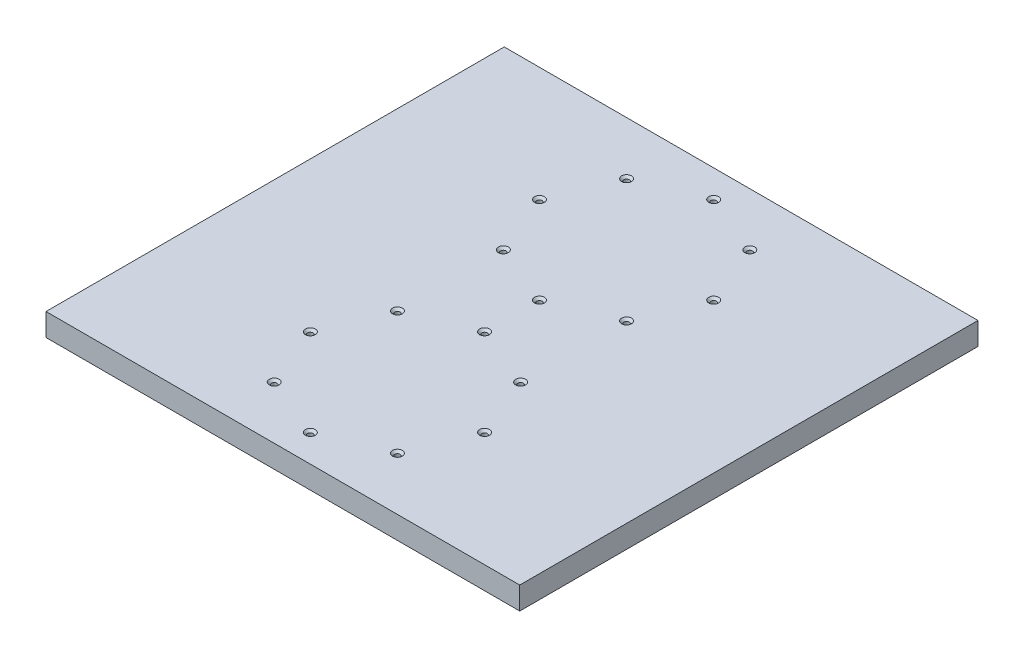
ISO-10303-21;
HEADER;
FILE_DESCRIPTION(('STEP AP214'),'2;1');
FILE_NAME('part.step','',(''),(''),'','','');
FILE_SCHEMA(('AUTOMOTIVE_DESIGN { 1 0 10303 214 1 1 1 1 }'));
ENDSEC;
DATA;
#1=APPLICATION_CONTEXT('core data for automotive mechanical design processes');
#2=APPLICATION_PROTOCOL_DEFINITION('international standard','automotive_design',2000,#1);
#3=PRODUCT_CONTEXT('',#1,'mechanical');
#4=PRODUCT('Part','Part','',(#3));
#5=PRODUCT_RELATED_PRODUCT_CATEGORY('part','',(#4));
#6=PRODUCT_DEFINITION_FORMATION('','',#4);
#7=PRODUCT_DEFINITION_CONTEXT('part definition',#1,'design');
#8=PRODUCT_DEFINITION('design','',#6,#7);
#9=PRODUCT_DEFINITION_SHAPE('','',#8);
#10=(LENGTH_UNIT() NAMED_UNIT(*) SI_UNIT(.MILLI.,.METRE.));
#11=(NAMED_UNIT(*) PLANE_ANGLE_UNIT() SI_UNIT($,.RADIAN.));
#12=(NAMED_UNIT(*) SI_UNIT($,.STERADIAN.) SOLID_ANGLE_UNIT());
#13=UNCERTAINTY_MEASURE_WITH_UNIT(LENGTH_MEASURE(1.E-05),#10,'distance_accuracy_value','');
#14=(GEOMETRIC_REPRESENTATION_CONTEXT(3) GLOBAL_UNCERTAINTY_ASSIGNED_CONTEXT((#13)) GLOBAL_UNIT_ASSIGNED_CONTEXT((#10,
#11,#12)) REPRESENTATION_CONTEXT('',''));
#15=CARTESIAN_POINT('',(0.,0.,0.));
#16=DIRECTION('',(0.,0.,1.));
#17=DIRECTION('',(1.,0.,0.));
#18=AXIS2_PLACEMENT_3D('',#15,#16,#17);
#19=CARTESIAN_POINT('',(-104.993043249937,10.,-50.7808728938607));
#20=DIRECTION('',(1.,0.,0.));
#21=DIRECTION('',(0.,0.,-1.));
#22=AXIS2_PLACEMENT_3D('',#19,#20,#21);
#23=PLANE('',#22);
#24=DIRECTION('',(0.,0.,1.));
#25=VECTOR('',#24,1.);
#26=CARTESIAN_POINT('',(-104.993043249937,0.,-50.7808728938607));
#27=LINE('',#26,#25);
#28=CARTESIAN_POINT('',(-104.993043249937,0.,-152.342618681582));
#29=VERTEX_POINT('',#28);
#30=CARTESIAN_POINT('',(-104.993043249937,0.,50.7808728938607));
#31=VERTEX_POINT('',#30);
#32=EDGE_CURVE('E76',#29,#31,#27,.T.);
#33=ORIENTED_EDGE('',*,*,#32,.T.);
#34=DIRECTION('',(0.,-1.,0.));
#35=VECTOR('',#34,1.);
#36=CARTESIAN_POINT('',(-104.993043249937,10.,50.7808728938607));
#37=LINE('',#36,#35);
#38=CARTESIAN_POINT('',(-104.993043249937,10.,50.7808728938607));
#39=VERTEX_POINT('',#38);
#40=EDGE_CURVE('E11',#39,#31,#37,.T.);
#41=ORIENTED_EDGE('',*,*,#40,.F.);
#42=DIRECTION('',(0.,0.,1.));
#43=VECTOR('',#42,1.);
#44=CARTESIAN_POINT('',(-104.993043249937,10.,-50.7808728938607));
#45=LINE('',#44,#43);
#46=CARTESIAN_POINT('',(-104.993043249937,10.,-152.342618681582));
#47=VERTEX_POINT('',#46);
#48=EDGE_CURVE('E67',#47,#39,#45,.T.);
#49=ORIENTED_EDGE('',*,*,#48,.F.);
#50=DIRECTION('',(0.,-1.,0.));
#51=VECTOR('',#50,1.);
#52=CARTESIAN_POINT('',(-104.993043249937,10.,-152.342618681582));
#53=LINE('',#52,#51);
#54=EDGE_CURVE('E82',#47,#29,#53,.T.);
#55=ORIENTED_EDGE('',*,*,#54,.T.);
#56=EDGE_LOOP('',(#33,#41,#49,#55));
#57=FACE_BOUND('',#56,.T.);
#58=ADVANCED_FACE('F33',(#57),#23,.F.);
#59=CARTESIAN_POINT('',(-104.993043249937,10.,50.7808728938607));
#60=DIRECTION('',(0.,0.,-1.));
#61=DIRECTION('',(-1.,0.,0.));
#62=AXIS2_PLACEMENT_3D('',#59,#60,#61);
#63=PLANE('',#62);
#64=DIRECTION('',(1.,0.,0.));
#65=VECTOR('',#64,1.);
#66=CARTESIAN_POINT('',(-104.993043249937,0.,50.7808728938607));
#67=LINE('',#66,#65);
#68=CARTESIAN_POINT('',(104.993043249937,0.,50.7808728938607));
#69=VERTEX_POINT('',#68);
#70=EDGE_CURVE('E60',#31,#69,#67,.T.);
#71=ORIENTED_EDGE('',*,*,#70,.T.);
#72=DIRECTION('',(0.,-1.,0.));
#73=VECTOR('',#72,1.);
#74=CARTESIAN_POINT('',(104.993043249937,10.,50.7808728938607));
#75=LINE('',#74,#73);
#76=CARTESIAN_POINT('',(104.993043249937,10.,50.7808728938607));
#77=VERTEX_POINT('',#76);
#78=EDGE_CURVE('E41',#77,#69,#75,.T.);
#79=ORIENTED_EDGE('',*,*,#78,.F.);
#80=DIRECTION('',(1.,0.,0.));
#81=VECTOR('',#80,1.);
#82=CARTESIAN_POINT('',(-104.993043249937,10.,50.7808728938607));
#83=LINE('',#82,#81);
#84=EDGE_CURVE('E49',#39,#77,#83,.T.);
#85=ORIENTED_EDGE('',*,*,#84,.F.);
#86=ORIENTED_EDGE('',*,*,#40,.T.);
#87=EDGE_LOOP('',(#71,#79,#85,#86));
#88=FACE_BOUND('',#87,.T.);
#89=ADVANCED_FACE('F182',(#88),#63,.F.);
#90=CARTESIAN_POINT('',(104.993043249937,10.,-50.7808728938607));
#91=DIRECTION('',(-1.,0.,0.));
#92=DIRECTION('',(0.,0.,1.));
#93=AXIS2_PLACEMENT_3D('',#90,#91,#92);
#94=PLANE('',#93);
#95=DIRECTION('',(0.,0.,-1.));
#96=VECTOR('',#95,1.);
#97=CARTESIAN_POINT('',(104.993043249937,0.,-50.7808728938607));
#98=LINE('',#97,#96);
#99=CARTESIAN_POINT('',(104.993043249937,0.,-152.342618681582));
#100=VERTEX_POINT('',#99);
#101=EDGE_CURVE('E172',#69,#100,#98,.T.);
#102=ORIENTED_EDGE('',*,*,#101,.T.);
#103=DIRECTION('',(0.,-1.,0.));
#104=VECTOR('',#103,1.);
#105=CARTESIAN_POINT('',(104.993043249937,10.,-152.342618681582));
#106=LINE('',#105,#104);
#107=CARTESIAN_POINT('',(104.993043249937,10.,-152.342618681582));
#108=VERTEX_POINT('',#107);
#109=EDGE_CURVE('E86',#108,#100,#106,.T.);
#110=ORIENTED_EDGE('',*,*,#109,.F.);
#111=DIRECTION('',(0.,0.,-1.));
#112=VECTOR('',#111,1.);
#113=CARTESIAN_POINT('',(104.993043249937,10.,-50.7808728938607));
#114=LINE('',#113,#112);
#115=EDGE_CURVE('E174',#77,#108,#114,.T.);
#116=ORIENTED_EDGE('',*,*,#115,.F.);
#117=ORIENTED_EDGE('',*,*,#78,.T.);
#118=EDGE_LOOP('',(#102,#110,#116,#117));
#119=FACE_BOUND('',#118,.T.);
#120=ADVANCED_FACE('F180',(#119),#94,.F.);
#121=CARTESIAN_POINT('',(0.,10.,0.));
#122=DIRECTION('',(0.,1.,0.));
#123=DIRECTION('',(0.,0.,1.));
#124=AXIS2_PLACEMENT_3D('',#121,#122,#123);
#125=PLANE('',#124);
#126=CARTESIAN_POINT('',(-27.3055006811137,10.,-128.867246468835));
#127=DIRECTION('',(0.,1.,0.));
#128=DIRECTION('',(0.,0.,1.));
#129=AXIS2_PLACEMENT_3D('',#126,#127,#128);
#130=CIRCLE('',#129,2.2);
#131=CARTESIAN_POINT('',(-27.3055006811137,10.,-126.667246468835));
#132=VERTEX_POINT('',#131);
#133=EDGE_CURVE('E627',#132,#132,#130,.T.);
#134=ORIENTED_EDGE('',*,*,#133,.F.);
#135=EDGE_LOOP('',(#134));
#136=FACE_BOUND('',#135,.T.);
#137=CARTESIAN_POINT('',(-4.04479133615002E-13,10.,-140.17755517834));
#138=DIRECTION('',(0.,1.,0.));
#139=DIRECTION('',(0.,0.,1.));
#140=AXIS2_PLACEMENT_3D('',#137,#138,#139);
#141=CIRCLE('',#140,2.2);
#142=CARTESIAN_POINT('',(-4.04479133615002E-13,10.,-137.97755517834));
#143=VERTEX_POINT('',#142);
#144=EDGE_CURVE('E634',#143,#143,#141,.T.);
#145=ORIENTED_EDGE('',*,*,#144,.F.);
#146=EDGE_LOOP('',(#145));
#147=FACE_BOUND('',#146,.T.);
#148=CARTESIAN_POINT('',(27.3055006811132,10.,-128.867246468835));
#149=DIRECTION('',(0.,1.,0.));
#150=DIRECTION('',(0.,0.,1.));
#151=AXIS2_PLACEMENT_3D('',#148,#149,#150);
#152=CIRCLE('',#151,2.2);
#153=CARTESIAN_POINT('',(27.3055006811132,10.,-126.667246468835));
#154=VERTEX_POINT('',#153);
#155=EDGE_CURVE('E643',#154,#154,#152,.T.);
#156=ORIENTED_EDGE('',*,*,#155,.F.);
#157=EDGE_LOOP('',(#156));
#158=FACE_BOUND('',#157,.T.);
#159=CARTESIAN_POINT('',(38.6158093906183,10.,-101.561745787721));
#160=DIRECTION('',(0.,1.,0.));
#161=DIRECTION('',(0.,0.,1.));
#162=AXIS2_PLACEMENT_3D('',#159,#160,#161);
#163=CIRCLE('',#162,2.2);
#164=CARTESIAN_POINT('',(38.6158093906183,10.,-99.3617457877215));
#165=VERTEX_POINT('',#164);
#166=EDGE_CURVE('E652',#165,#165,#163,.T.);
#167=ORIENTED_EDGE('',*,*,#166,.F.);
#168=EDGE_LOOP('',(#167));
#169=FACE_BOUND('',#168,.T.);
#170=CARTESIAN_POINT('',(27.3055006811135,10.,-74.2562451066082));
#171=DIRECTION('',(0.,1.,0.));
#172=DIRECTION('',(0.,0.,1.));
#173=AXIS2_PLACEMENT_3D('',#170,#171,#172);
#174=CIRCLE('',#173,2.2);
#175=CARTESIAN_POINT('',(27.3055006811135,10.,-72.0562451066082));
#176=VERTEX_POINT('',#175);
#177=EDGE_CURVE('E661',#176,#176,#174,.T.);
#178=ORIENTED_EDGE('',*,*,#177,.F.);
#179=EDGE_LOOP('',(#178));
#180=FACE_BOUND('',#179,.T.);
#181=CARTESIAN_POINT('',(1.34826377871667E-13,10.,-62.9459363971031));
#182=DIRECTION('',(0.,1.,0.));
#183=DIRECTION('',(0.,0.,1.));
#184=AXIS2_PLACEMENT_3D('',#181,#182,#183);
#185=CIRCLE('',#184,2.2);
#186=CARTESIAN_POINT('',(1.34826377871667E-13,10.,-60.7459363971031));
#187=VERTEX_POINT('',#186);
#188=EDGE_CURVE('E670',#187,#187,#185,.T.);
#189=ORIENTED_EDGE('',*,*,#188,.F.);
#190=EDGE_LOOP('',(#189));
#191=FACE_BOUND('',#190,.T.);
#192=CARTESIAN_POINT('',(-27.3055006811133,10.,-74.256245106608));
#193=DIRECTION('',(0.,1.,0.));
#194=DIRECTION('',(0.,0.,1.));
#195=AXIS2_PLACEMENT_3D('',#192,#193,#194);
#196=CIRCLE('',#195,2.2);
#197=CARTESIAN_POINT('',(-27.3055006811133,10.,-72.056245106608));
#198=VERTEX_POINT('',#197);
#199=EDGE_CURVE('E679',#198,#198,#196,.T.);
#200=ORIENTED_EDGE('',*,*,#199,.F.);
#201=EDGE_LOOP('',(#200));
#202=FACE_BOUND('',#201,.T.);
#203=CARTESIAN_POINT('',(-38.6158093906183,10.,-101.561745787721));
#204=DIRECTION('',(0.,1.,0.));
#205=DIRECTION('',(0.,0.,1.));
#206=AXIS2_PLACEMENT_3D('',#203,#204,#205);
#207=CIRCLE('',#206,2.2);
#208=CARTESIAN_POINT('',(-38.6158093906183,10.,-99.3617457877215));
#209=VERTEX_POINT('',#208);
#210=EDGE_CURVE('E688',#209,#209,#207,.T.);
#211=ORIENTED_EDGE('',*,*,#210,.F.);
#212=EDGE_LOOP('',(#211));
#213=FACE_BOUND('',#212,.T.);
#214=CARTESIAN_POINT('',(-27.3055006811137,10.,27.3055006811131));
#215=DIRECTION('',(0.,1.,0.));
#216=DIRECTION('',(0.,0.,1.));
#217=AXIS2_PLACEMENT_3D('',#214,#215,#216);
#218=CIRCLE('',#217,2.2);
#219=CARTESIAN_POINT('',(-27.3055006811137,10.,29.5055006811131));
#220=VERTEX_POINT('',#219);
#221=EDGE_CURVE('E100',#220,#220,#218,.T.);
#222=ORIENTED_EDGE('',*,*,#221,.F.);
#223=EDGE_LOOP('',(#222));
#224=FACE_BOUND('',#223,.T.);
#225=CARTESIAN_POINT('',(-4.04479133615002E-13,10.,38.6158093906183));
#226=DIRECTION('',(0.,1.,0.));
#227=DIRECTION('',(0.,0.,1.));
#228=AXIS2_PLACEMENT_3D('',#225,#226,#227);
#229=CIRCLE('',#228,2.2);
#230=CARTESIAN_POINT('',(-4.04479133615002E-13,10.,40.8158093906183));
#231=VERTEX_POINT('',#230);
#232=EDGE_CURVE('E109',#231,#231,#229,.T.);
#233=ORIENTED_EDGE('',*,*,#232,.F.);
#234=EDGE_LOOP('',(#233));
#235=FACE_BOUND('',#234,.T.);
#236=CARTESIAN_POINT('',(27.3055006811132,10.,27.3055006811136));
#237=DIRECTION('',(0.,1.,0.));
#238=DIRECTION('',(0.,0.,1.));
#239=AXIS2_PLACEMENT_3D('',#236,#237,#238);
#240=CIRCLE('',#239,2.2);
#241=CARTESIAN_POINT('',(27.3055006811132,10.,29.5055006811136));
#242=VERTEX_POINT('',#241);
#243=EDGE_CURVE('E118',#242,#242,#240,.T.);
#244=ORIENTED_EDGE('',*,*,#243,.F.);
#245=EDGE_LOOP('',(#244));
#246=FACE_BOUND('',#245,.T.);
#247=CARTESIAN_POINT('',(38.6158093906183,10.,0.));
#248=DIRECTION('',(0.,1.,0.));
#249=DIRECTION('',(0.,0.,1.));
#250=AXIS2_PLACEMENT_3D('',#247,#248,#249);
#251=CIRCLE('',#250,2.2);
#252=CARTESIAN_POINT('',(38.6158093906183,10.,2.2));
#253=VERTEX_POINT('',#252);
#254=EDGE_CURVE('E127',#253,#253,#251,.T.);
#255=ORIENTED_EDGE('',*,*,#254,.F.);
#256=EDGE_LOOP('',(#255));
#257=FACE_BOUND('',#256,.T.);
#258=CARTESIAN_POINT('',(27.3055006811135,10.,-27.3055006811132));
#259=DIRECTION('',(0.,1.,0.));
#260=DIRECTION('',(0.,0.,1.));
#261=AXIS2_PLACEMENT_3D('',#258,#259,#260);
#262=CIRCLE('',#261,2.2);
#263=CARTESIAN_POINT('',(27.3055006811135,10.,-25.1055006811132));
#264=VERTEX_POINT('',#263);
#265=EDGE_CURVE('E136',#264,#264,#262,.T.);
#266=ORIENTED_EDGE('',*,*,#265,.F.);
#267=EDGE_LOOP('',(#266));
#268=FACE_BOUND('',#267,.T.);
#269=CARTESIAN_POINT('',(1.34826377871667E-13,10.,-38.6158093906183));
#270=DIRECTION('',(0.,1.,0.));
#271=DIRECTION('',(0.,0.,1.));
#272=AXIS2_PLACEMENT_3D('',#269,#270,#271);
#273=CIRCLE('',#272,2.2);
#274=CARTESIAN_POINT('',(1.34826377871667E-13,10.,-36.4158093906183));
#275=VERTEX_POINT('',#274);
#276=EDGE_CURVE('E145',#275,#275,#273,.T.);
#277=ORIENTED_EDGE('',*,*,#276,.F.);
#278=EDGE_LOOP('',(#277));
#279=FACE_BOUND('',#278,.T.);
#280=CARTESIAN_POINT('',(-27.3055006811133,10.,-27.3055006811134));
#281=DIRECTION('',(0.,1.,0.));
#282=DIRECTION('',(0.,0.,1.));
#283=AXIS2_PLACEMENT_3D('',#280,#281,#282);
#284=CIRCLE('',#283,2.2);
#285=CARTESIAN_POINT('',(-27.3055006811133,10.,-25.1055006811134));
#286=VERTEX_POINT('',#285);
#287=EDGE_CURVE('E154',#286,#286,#284,.T.);
#288=ORIENTED_EDGE('',*,*,#287,.F.);
#289=EDGE_LOOP('',(#288));
#290=FACE_BOUND('',#289,.T.);
#291=CARTESIAN_POINT('',(-38.6158093906183,10.,0.));
#292=DIRECTION('',(0.,1.,0.));
#293=DIRECTION('',(0.,0.,1.));
#294=AXIS2_PLACEMENT_3D('',#291,#292,#293);
#295=CIRCLE('',#294,2.2);
#296=CARTESIAN_POINT('',(-38.6158093906183,10.,2.2));
#297=VERTEX_POINT('',#296);
#298=EDGE_CURVE('E163',#297,#297,#295,.T.);
#299=ORIENTED_EDGE('',*,*,#298,.F.);
#300=EDGE_LOOP('',(#299));
#301=FACE_BOUND('',#300,.T.);
#302=ORIENTED_EDGE('',*,*,#48,.T.);
#303=ORIENTED_EDGE('',*,*,#84,.T.);
#304=ORIENTED_EDGE('',*,*,#115,.T.);
#305=DIRECTION('',(1.,0.,0.));
#306=VECTOR('',#305,1.);
#307=CARTESIAN_POINT('',(-104.993043249937,10.,-152.342618681582));
#308=LINE('',#307,#306);
#309=EDGE_CURVE('E87',#47,#108,#308,.T.);
#310=ORIENTED_EDGE('',*,*,#309,.F.);
#311=EDGE_LOOP('',(#302,#303,#304,#310));
#312=FACE_BOUND('',#311,.T.);
#313=ADVANCED_FACE('F183',(#136,#147,#158,#169,#180,#191,#202,#213,#224,#235,#246,#257,#268,
#279,#290,#301,#312),#125,.T.);
#314=CARTESIAN_POINT('',(0.,0.,0.));
#315=DIRECTION('',(0.,1.,0.));
#316=DIRECTION('',(0.,0.,1.));
#317=AXIS2_PLACEMENT_3D('',#314,#315,#316);
#318=PLANE('',#317);
#319=CARTESIAN_POINT('',(-27.3055006811137,0.,-128.867246468835));
#320=DIRECTION('',(0.,1.,0.));
#321=DIRECTION('',(0.,0.,1.));
#322=AXIS2_PLACEMENT_3D('',#319,#320,#321);
#323=CIRCLE('',#322,1.2);
#324=CARTESIAN_POINT('',(-27.3055006811137,0.,-127.667246468835));
#325=VERTEX_POINT('',#324);
#326=EDGE_CURVE('E629',#325,#325,#323,.T.);
#327=ORIENTED_EDGE('',*,*,#326,.T.);
#328=EDGE_LOOP('',(#327));
#329=FACE_BOUND('',#328,.T.);
#330=CARTESIAN_POINT('',(-4.04479133615002E-13,0.,-140.17755517834));
#331=DIRECTION('',(0.,1.,0.));
#332=DIRECTION('',(0.,0.,1.));
#333=AXIS2_PLACEMENT_3D('',#330,#331,#332);
#334=CIRCLE('',#333,1.2);
#335=CARTESIAN_POINT('',(-4.04479133615002E-13,0.,-138.97755517834));
#336=VERTEX_POINT('',#335);
#337=EDGE_CURVE('E640',#336,#336,#334,.T.);
#338=ORIENTED_EDGE('',*,*,#337,.T.);
#339=EDGE_LOOP('',(#338));
#340=FACE_BOUND('',#339,.T.);
#341=CARTESIAN_POINT('',(27.3055006811132,0.,-128.867246468835));
#342=DIRECTION('',(0.,1.,0.));
#343=DIRECTION('',(0.,0.,1.));
#344=AXIS2_PLACEMENT_3D('',#341,#342,#343);
#345=CIRCLE('',#344,1.2);
#346=CARTESIAN_POINT('',(27.3055006811132,0.,-127.667246468835));
#347=VERTEX_POINT('',#346);
#348=EDGE_CURVE('E649',#347,#347,#345,.T.);
#349=ORIENTED_EDGE('',*,*,#348,.T.);
#350=EDGE_LOOP('',(#349));
#351=FACE_BOUND('',#350,.T.);
#352=CARTESIAN_POINT('',(38.6158093906183,0.,-101.561745787721));
#353=DIRECTION('',(0.,1.,0.));
#354=DIRECTION('',(0.,0.,1.));
#355=AXIS2_PLACEMENT_3D('',#352,#353,#354);
#356=CIRCLE('',#355,1.2);
#357=CARTESIAN_POINT('',(38.6158093906183,0.,-100.361745787721));
#358=VERTEX_POINT('',#357);
#359=EDGE_CURVE('E658',#358,#358,#356,.T.);
#360=ORIENTED_EDGE('',*,*,#359,.T.);
#361=EDGE_LOOP('',(#360));
#362=FACE_BOUND('',#361,.T.);
#363=CARTESIAN_POINT('',(27.3055006811135,0.,-74.2562451066082));
#364=DIRECTION('',(0.,1.,0.));
#365=DIRECTION('',(0.,0.,1.));
#366=AXIS2_PLACEMENT_3D('',#363,#364,#365);
#367=CIRCLE('',#366,1.2);
#368=CARTESIAN_POINT('',(27.3055006811135,0.,-73.0562451066082));
#369=VERTEX_POINT('',#368);
#370=EDGE_CURVE('E667',#369,#369,#367,.T.);
#371=ORIENTED_EDGE('',*,*,#370,.T.);
#372=EDGE_LOOP('',(#371));
#373=FACE_BOUND('',#372,.T.);
#374=CARTESIAN_POINT('',(1.34826377871667E-13,0.,-62.9459363971031));
#375=DIRECTION('',(0.,1.,0.));
#376=DIRECTION('',(0.,0.,1.));
#377=AXIS2_PLACEMENT_3D('',#374,#375,#376);
#378=CIRCLE('',#377,1.2);
#379=CARTESIAN_POINT('',(1.34826377871667E-13,0.,-61.7459363971031));
#380=VERTEX_POINT('',#379);
#381=EDGE_CURVE('E676',#380,#380,#378,.T.);
#382=ORIENTED_EDGE('',*,*,#381,.T.);
#383=EDGE_LOOP('',(#382));
#384=FACE_BOUND('',#383,.T.);
#385=CARTESIAN_POINT('',(-27.3055006811133,0.,-74.256245106608));
#386=DIRECTION('',(0.,1.,0.));
#387=DIRECTION('',(0.,0.,1.));
#388=AXIS2_PLACEMENT_3D('',#385,#386,#387);
#389=CIRCLE('',#388,1.2);
#390=CARTESIAN_POINT('',(-27.3055006811133,0.,-73.056245106608));
#391=VERTEX_POINT('',#390);
#392=EDGE_CURVE('E685',#391,#391,#389,.T.);
#393=ORIENTED_EDGE('',*,*,#392,.T.);
#394=EDGE_LOOP('',(#393));
#395=FACE_BOUND('',#394,.T.);
#396=CARTESIAN_POINT('',(-38.6158093906183,0.,-101.561745787721));
#397=DIRECTION('',(0.,1.,0.));
#398=DIRECTION('',(0.,0.,1.));
#399=AXIS2_PLACEMENT_3D('',#396,#397,#398);
#400=CIRCLE('',#399,1.2);
#401=CARTESIAN_POINT('',(-38.6158093906183,0.,-100.361745787721));
#402=VERTEX_POINT('',#401);
#403=EDGE_CURVE('E92',#402,#402,#400,.T.);
#404=ORIENTED_EDGE('',*,*,#403,.T.);
#405=EDGE_LOOP('',(#404));
#406=FACE_BOUND('',#405,.T.);
#407=CARTESIAN_POINT('',(-27.3055006811137,0.,27.3055006811131));
#408=DIRECTION('',(0.,1.,0.));
#409=DIRECTION('',(0.,0.,1.));
#410=AXIS2_PLACEMENT_3D('',#407,#408,#409);
#411=CIRCLE('',#410,1.2);
#412=CARTESIAN_POINT('',(-27.3055006811137,0.,28.5055006811131));
#413=VERTEX_POINT('',#412);
#414=EDGE_CURVE('E106',#413,#413,#411,.T.);
#415=ORIENTED_EDGE('',*,*,#414,.T.);
#416=EDGE_LOOP('',(#415));
#417=FACE_BOUND('',#416,.T.);
#418=CARTESIAN_POINT('',(-4.04479133615002E-13,0.,38.6158093906183));
#419=DIRECTION('',(0.,1.,0.));
#420=DIRECTION('',(0.,0.,1.));
#421=AXIS2_PLACEMENT_3D('',#418,#419,#420);
#422=CIRCLE('',#421,1.2);
#423=CARTESIAN_POINT('',(-4.04479133615002E-13,0.,39.8158093906183));
#424=VERTEX_POINT('',#423);
#425=EDGE_CURVE('E115',#424,#424,#422,.T.);
#426=ORIENTED_EDGE('',*,*,#425,.T.);
#427=EDGE_LOOP('',(#426));
#428=FACE_BOUND('',#427,.T.);
#429=CARTESIAN_POINT('',(27.3055006811132,0.,27.3055006811136));
#430=DIRECTION('',(0.,1.,0.));
#431=DIRECTION('',(0.,0.,1.));
#432=AXIS2_PLACEMENT_3D('',#429,#430,#431);
#433=CIRCLE('',#432,1.2);
#434=CARTESIAN_POINT('',(27.3055006811132,0.,28.5055006811136));
#435=VERTEX_POINT('',#434);
#436=EDGE_CURVE('E124',#435,#435,#433,.T.);
#437=ORIENTED_EDGE('',*,*,#436,.T.);
#438=EDGE_LOOP('',(#437));
#439=FACE_BOUND('',#438,.T.);
#440=CARTESIAN_POINT('',(38.6158093906183,0.,0.));
#441=DIRECTION('',(0.,1.,0.));
#442=DIRECTION('',(0.,0.,1.));
#443=AXIS2_PLACEMENT_3D('',#440,#441,#442);
#444=CIRCLE('',#443,1.2);
#445=CARTESIAN_POINT('',(38.6158093906183,0.,1.2));
#446=VERTEX_POINT('',#445);
#447=EDGE_CURVE('E133',#446,#446,#444,.T.);
#448=ORIENTED_EDGE('',*,*,#447,.T.);
#449=EDGE_LOOP('',(#448));
#450=FACE_BOUND('',#449,.T.);
#451=CARTESIAN_POINT('',(27.3055006811135,0.,-27.3055006811132));
#452=DIRECTION('',(0.,1.,0.));
#453=DIRECTION('',(0.,0.,1.));
#454=AXIS2_PLACEMENT_3D('',#451,#452,#453);
#455=CIRCLE('',#454,1.2);
#456=CARTESIAN_POINT('',(27.3055006811135,0.,-26.1055006811133));
#457=VERTEX_POINT('',#456);
#458=EDGE_CURVE('E142',#457,#457,#455,.T.);
#459=ORIENTED_EDGE('',*,*,#458,.T.);
#460=EDGE_LOOP('',(#459));
#461=FACE_BOUND('',#460,.T.);
#462=CARTESIAN_POINT('',(1.34826377871667E-13,0.,-38.6158093906183));
#463=DIRECTION('',(0.,1.,0.));
#464=DIRECTION('',(0.,0.,1.));
#465=AXIS2_PLACEMENT_3D('',#462,#463,#464);
#466=CIRCLE('',#465,1.2);
#467=CARTESIAN_POINT('',(1.34826377871667E-13,0.,-37.4158093906183));
#468=VERTEX_POINT('',#467);
#469=EDGE_CURVE('E151',#468,#468,#466,.T.);
#470=ORIENTED_EDGE('',*,*,#469,.T.);
#471=EDGE_LOOP('',(#470));
#472=FACE_BOUND('',#471,.T.);
#473=CARTESIAN_POINT('',(-27.3055006811133,0.,-27.3055006811134));
#474=DIRECTION('',(0.,1.,0.));
#475=DIRECTION('',(0.,0.,1.));
#476=AXIS2_PLACEMENT_3D('',#473,#474,#475);
#477=CIRCLE('',#476,1.2);
#478=CARTESIAN_POINT('',(-27.3055006811133,0.,-26.1055006811134));
#479=VERTEX_POINT('',#478);
#480=EDGE_CURVE('E160',#479,#479,#477,.T.);
#481=ORIENTED_EDGE('',*,*,#480,.T.);
#482=EDGE_LOOP('',(#481));
#483=FACE_BOUND('',#482,.T.);
#484=CARTESIAN_POINT('',(-38.6158093906183,0.,0.));
#485=DIRECTION('',(0.,1.,0.));
#486=DIRECTION('',(0.,0.,1.));
#487=AXIS2_PLACEMENT_3D('',#484,#485,#486);
#488=CIRCLE('',#487,1.2);
#489=CARTESIAN_POINT('',(-38.6158093906183,0.,1.2));
#490=VERTEX_POINT('',#489);
#491=EDGE_CURVE('E80',#490,#490,#488,.T.);
#492=ORIENTED_EDGE('',*,*,#491,.T.);
#493=EDGE_LOOP('',(#492));
#494=FACE_BOUND('',#493,.T.);
#495=ORIENTED_EDGE('',*,*,#32,.F.);
#496=DIRECTION('',(1.,0.,0.));
#497=VECTOR('',#496,1.);
#498=CARTESIAN_POINT('',(-104.993043249937,0.,-152.342618681582));
#499=LINE('',#498,#497);
#500=EDGE_CURVE('E79',#29,#100,#499,.T.);
#501=ORIENTED_EDGE('',*,*,#500,.T.);
#502=ORIENTED_EDGE('',*,*,#101,.F.);
#503=ORIENTED_EDGE('',*,*,#70,.F.);
#504=EDGE_LOOP('',(#495,#501,#502,#503));
#505=FACE_BOUND('',#504,.T.);
#506=ADVANCED_FACE('F77',(#329,#340,#351,#362,#373,#384,#395,#406,#417,#428,#439,#450,#461,#472,
#483,#494,#505),#318,.F.);
#507=CARTESIAN_POINT('',(-38.6158093906183,10.,0.));
#508=DIRECTION('',(0.,1.,0.));
#509=DIRECTION('',(0.,0.,1.));
#510=AXIS2_PLACEMENT_3D('',#507,#508,#509);
#511=CYLINDRICAL_SURFACE('',#510,1.2);
#512=ORIENTED_EDGE('',*,*,#491,.F.);
#513=EDGE_LOOP('',(#512));
#514=FACE_BOUND('',#513,.T.);
#515=CARTESIAN_POINT('',(-38.6158093906183,9.,0.));
#516=DIRECTION('',(0.,1.,0.));
#517=DIRECTION('',(0.,0.,1.));
#518=AXIS2_PLACEMENT_3D('',#515,#516,#517);
#519=CIRCLE('',#518,1.2);
#520=CARTESIAN_POINT('',(-38.6158093906183,9.,1.2));
#521=VERTEX_POINT('',#520);
#522=EDGE_CURVE('E166',#521,#521,#519,.T.);
#523=ORIENTED_EDGE('',*,*,#522,.T.);
#524=EDGE_LOOP('',(#523));
#525=FACE_BOUND('',#524,.T.);
#526=ADVANCED_FACE('F191',(#514,#525),#511,.F.);
#527=CARTESIAN_POINT('',(-38.6158093906183,10.,0.));
#528=DIRECTION('',(0.,1.,0.));
#529=DIRECTION('',(0.,0.,1.));
#530=AXIS2_PLACEMENT_3D('',#527,#528,#529);
#531=CONICAL_SURFACE('',#530,2.2,0.785398163397447);
#532=ORIENTED_EDGE('',*,*,#522,.F.);
#533=EDGE_LOOP('',(#532));
#534=FACE_BOUND('',#533,.T.);
#535=ORIENTED_EDGE('',*,*,#298,.T.);
#536=EDGE_LOOP('',(#535));
#537=FACE_BOUND('',#536,.T.);
#538=ADVANCED_FACE('F456',(#534,#537),#531,.F.);
#539=CARTESIAN_POINT('',(-27.3055006811133,10.,-27.3055006811134));
#540=DIRECTION('',(0.,1.,0.));
#541=DIRECTION('',(0.,0.,1.));
#542=AXIS2_PLACEMENT_3D('',#539,#540,#541);
#543=CYLINDRICAL_SURFACE('',#542,1.2);
#544=ORIENTED_EDGE('',*,*,#480,.F.);
#545=EDGE_LOOP('',(#544));
#546=FACE_BOUND('',#545,.T.);
#547=CARTESIAN_POINT('',(-27.3055006811133,9.,-27.3055006811134));
#548=DIRECTION('',(0.,1.,0.));
#549=DIRECTION('',(0.,0.,1.));
#550=AXIS2_PLACEMENT_3D('',#547,#548,#549);
#551=CIRCLE('',#550,1.2);
#552=CARTESIAN_POINT('',(-27.3055006811133,9.,-26.1055006811134));
#553=VERTEX_POINT('',#552);
#554=EDGE_CURVE('E157',#553,#553,#551,.T.);
#555=ORIENTED_EDGE('',*,*,#554,.T.);
#556=EDGE_LOOP('',(#555));
#557=FACE_BOUND('',#556,.T.);
#558=ADVANCED_FACE('F452',(#546,#557),#543,.F.);
#559=CARTESIAN_POINT('',(-27.3055006811133,10.,-27.3055006811134));
#560=DIRECTION('',(0.,1.,0.));
#561=DIRECTION('',(0.,0.,1.));
#562=AXIS2_PLACEMENT_3D('',#559,#560,#561);
#563=CONICAL_SURFACE('',#562,2.2,0.785398163397447);
#564=ORIENTED_EDGE('',*,*,#554,.F.);
#565=EDGE_LOOP('',(#564));
#566=FACE_BOUND('',#565,.T.);
#567=ORIENTED_EDGE('',*,*,#287,.T.);
#568=EDGE_LOOP('',(#567));
#569=FACE_BOUND('',#568,.T.);
#570=ADVANCED_FACE('F448',(#566,#569),#563,.F.);
#571=CARTESIAN_POINT('',(1.34826377871667E-13,10.,-38.6158093906183));
#572=DIRECTION('',(0.,1.,0.));
#573=DIRECTION('',(0.,0.,1.));
#574=AXIS2_PLACEMENT_3D('',#571,#572,#573);
#575=CYLINDRICAL_SURFACE('',#574,1.2);
#576=ORIENTED_EDGE('',*,*,#469,.F.);
#577=EDGE_LOOP('',(#576));
#578=FACE_BOUND('',#577,.T.);
#579=CARTESIAN_POINT('',(1.34826377871667E-13,9.,-38.6158093906183));
#580=DIRECTION('',(0.,1.,0.));
#581=DIRECTION('',(0.,0.,1.));
#582=AXIS2_PLACEMENT_3D('',#579,#580,#581);
#583=CIRCLE('',#582,1.2);
#584=CARTESIAN_POINT('',(1.34826377871667E-13,9.,-37.4158093906183));
#585=VERTEX_POINT('',#584);
#586=EDGE_CURVE('E148',#585,#585,#583,.T.);
#587=ORIENTED_EDGE('',*,*,#586,.T.);
#588=EDGE_LOOP('',(#587));
#589=FACE_BOUND('',#588,.T.);
#590=ADVANCED_FACE('F444',(#578,#589),#575,.F.);
#591=CARTESIAN_POINT('',(1.34826377871667E-13,10.,-38.6158093906183));
#592=DIRECTION('',(0.,1.,0.));
#593=DIRECTION('',(0.,0.,1.));
#594=AXIS2_PLACEMENT_3D('',#591,#592,#593);
#595=CONICAL_SURFACE('',#594,2.2,0.785398163397448);
#596=ORIENTED_EDGE('',*,*,#586,.F.);
#597=EDGE_LOOP('',(#596));
#598=FACE_BOUND('',#597,.T.);
#599=ORIENTED_EDGE('',*,*,#276,.T.);
#600=EDGE_LOOP('',(#599));
#601=FACE_BOUND('',#600,.T.);
#602=ADVANCED_FACE('F440',(#598,#601),#595,.F.);
#603=CARTESIAN_POINT('',(27.3055006811135,10.,-27.3055006811132));
#604=DIRECTION('',(0.,1.,0.));
#605=DIRECTION('',(0.,0.,1.));
#606=AXIS2_PLACEMENT_3D('',#603,#604,#605);
#607=CYLINDRICAL_SURFACE('',#606,1.2);
#608=ORIENTED_EDGE('',*,*,#458,.F.);
#609=EDGE_LOOP('',(#608));
#610=FACE_BOUND('',#609,.T.);
#611=CARTESIAN_POINT('',(27.3055006811135,9.,-27.3055006811132));
#612=DIRECTION('',(0.,1.,0.));
#613=DIRECTION('',(0.,0.,1.));
#614=AXIS2_PLACEMENT_3D('',#611,#612,#613);
#615=CIRCLE('',#614,1.2);
#616=CARTESIAN_POINT('',(27.3055006811135,9.,-26.1055006811132));
#617=VERTEX_POINT('',#616);
#618=EDGE_CURVE('E139',#617,#617,#615,.T.);
#619=ORIENTED_EDGE('',*,*,#618,.T.);
#620=EDGE_LOOP('',(#619));
#621=FACE_BOUND('',#620,.T.);
#622=ADVANCED_FACE('F436',(#610,#621),#607,.F.);
#623=CARTESIAN_POINT('',(27.3055006811135,10.,-27.3055006811132));
#624=DIRECTION('',(0.,1.,0.));
#625=DIRECTION('',(0.,0.,1.));
#626=AXIS2_PLACEMENT_3D('',#623,#624,#625);
#627=CONICAL_SURFACE('',#626,2.2,0.785398163397447);
#628=ORIENTED_EDGE('',*,*,#618,.F.);
#629=EDGE_LOOP('',(#628));
#630=FACE_BOUND('',#629,.T.);
#631=ORIENTED_EDGE('',*,*,#265,.T.);
#632=EDGE_LOOP('',(#631));
#633=FACE_BOUND('',#632,.T.);
#634=ADVANCED_FACE('F432',(#630,#633),#627,.F.);
#635=CARTESIAN_POINT('',(38.6158093906183,10.,0.));
#636=DIRECTION('',(0.,1.,0.));
#637=DIRECTION('',(0.,0.,1.));
#638=AXIS2_PLACEMENT_3D('',#635,#636,#637);
#639=CYLINDRICAL_SURFACE('',#638,1.2);
#640=ORIENTED_EDGE('',*,*,#447,.F.);
#641=EDGE_LOOP('',(#640));
#642=FACE_BOUND('',#641,.T.);
#643=CARTESIAN_POINT('',(38.6158093906183,9.,0.));
#644=DIRECTION('',(0.,1.,0.));
#645=DIRECTION('',(0.,0.,1.));
#646=AXIS2_PLACEMENT_3D('',#643,#644,#645);
#647=CIRCLE('',#646,1.2);
#648=CARTESIAN_POINT('',(38.6158093906183,9.,1.2));
#649=VERTEX_POINT('',#648);
#650=EDGE_CURVE('E130',#649,#649,#647,.T.);
#651=ORIENTED_EDGE('',*,*,#650,.T.);
#652=EDGE_LOOP('',(#651));
#653=FACE_BOUND('',#652,.T.);
#654=ADVANCED_FACE('F428',(#642,#653),#639,.F.);
#655=CARTESIAN_POINT('',(38.6158093906183,10.,0.));
#656=DIRECTION('',(0.,1.,0.));
#657=DIRECTION('',(0.,0.,1.));
#658=AXIS2_PLACEMENT_3D('',#655,#656,#657);
#659=CONICAL_SURFACE('',#658,2.2,0.785398163397447);
#660=ORIENTED_EDGE('',*,*,#650,.F.);
#661=EDGE_LOOP('',(#660));
#662=FACE_BOUND('',#661,.T.);
#663=ORIENTED_EDGE('',*,*,#254,.T.);
#664=EDGE_LOOP('',(#663));
#665=FACE_BOUND('',#664,.T.);
#666=ADVANCED_FACE('F424',(#662,#665),#659,.F.);
#667=CARTESIAN_POINT('',(27.3055006811132,10.,27.3055006811136));
#668=DIRECTION('',(0.,1.,0.));
#669=DIRECTION('',(0.,0.,1.));
#670=AXIS2_PLACEMENT_3D('',#667,#668,#669);
#671=CYLINDRICAL_SURFACE('',#670,1.2);
#672=ORIENTED_EDGE('',*,*,#436,.F.);
#673=EDGE_LOOP('',(#672));
#674=FACE_BOUND('',#673,.T.);
#675=CARTESIAN_POINT('',(27.3055006811132,9.,27.3055006811136));
#676=DIRECTION('',(0.,1.,0.));
#677=DIRECTION('',(0.,0.,1.));
#678=AXIS2_PLACEMENT_3D('',#675,#676,#677);
#679=CIRCLE('',#678,1.2);
#680=CARTESIAN_POINT('',(27.3055006811132,9.,28.5055006811136));
#681=VERTEX_POINT('',#680);
#682=EDGE_CURVE('E121',#681,#681,#679,.T.);
#683=ORIENTED_EDGE('',*,*,#682,.T.);
#684=EDGE_LOOP('',(#683));
#685=FACE_BOUND('',#684,.T.);
#686=ADVANCED_FACE('F420',(#674,#685),#671,.F.);
#687=CARTESIAN_POINT('',(27.3055006811132,10.,27.3055006811136));
#688=DIRECTION('',(0.,1.,0.));
#689=DIRECTION('',(0.,0.,1.));
#690=AXIS2_PLACEMENT_3D('',#687,#688,#689);
#691=CONICAL_SURFACE('',#690,2.2,0.785398163397447);
#692=ORIENTED_EDGE('',*,*,#682,.F.);
#693=EDGE_LOOP('',(#692));
#694=FACE_BOUND('',#693,.T.);
#695=ORIENTED_EDGE('',*,*,#243,.T.);
#696=EDGE_LOOP('',(#695));
#697=FACE_BOUND('',#696,.T.);
#698=ADVANCED_FACE('F416',(#694,#697),#691,.F.);
#699=CARTESIAN_POINT('',(-4.04479133615002E-13,10.,38.6158093906183));
#700=DIRECTION('',(0.,1.,0.));
#701=DIRECTION('',(0.,0.,1.));
#702=AXIS2_PLACEMENT_3D('',#699,#700,#701);
#703=CYLINDRICAL_SURFACE('',#702,1.2);
#704=ORIENTED_EDGE('',*,*,#425,.F.);
#705=EDGE_LOOP('',(#704));
#706=FACE_BOUND('',#705,.T.);
#707=CARTESIAN_POINT('',(-4.04479133615002E-13,9.,38.6158093906183));
#708=DIRECTION('',(0.,1.,0.));
#709=DIRECTION('',(0.,0.,1.));
#710=AXIS2_PLACEMENT_3D('',#707,#708,#709);
#711=CIRCLE('',#710,1.2);
#712=CARTESIAN_POINT('',(-4.04479133615002E-13,9.,39.8158093906183));
#713=VERTEX_POINT('',#712);
#714=EDGE_CURVE('E112',#713,#713,#711,.T.);
#715=ORIENTED_EDGE('',*,*,#714,.T.);
#716=EDGE_LOOP('',(#715));
#717=FACE_BOUND('',#716,.T.);
#718=ADVANCED_FACE('F412',(#706,#717),#703,.F.);
#719=CARTESIAN_POINT('',(-4.04479133615002E-13,10.,38.6158093906183));
#720=DIRECTION('',(0.,1.,0.));
#721=DIRECTION('',(0.,0.,1.));
#722=AXIS2_PLACEMENT_3D('',#719,#720,#721);
#723=CONICAL_SURFACE('',#722,2.2,0.785398163397448);
#724=ORIENTED_EDGE('',*,*,#714,.F.);
#725=EDGE_LOOP('',(#724));
#726=FACE_BOUND('',#725,.T.);
#727=ORIENTED_EDGE('',*,*,#232,.T.);
#728=EDGE_LOOP('',(#727));
#729=FACE_BOUND('',#728,.T.);
#730=ADVANCED_FACE('F408',(#726,#729),#723,.F.);
#731=CARTESIAN_POINT('',(-27.3055006811137,10.,27.3055006811131));
#732=DIRECTION('',(0.,1.,0.));
#733=DIRECTION('',(0.,0.,1.));
#734=AXIS2_PLACEMENT_3D('',#731,#732,#733);
#735=CYLINDRICAL_SURFACE('',#734,1.2);
#736=ORIENTED_EDGE('',*,*,#414,.F.);
#737=EDGE_LOOP('',(#736));
#738=FACE_BOUND('',#737,.T.);
#739=CARTESIAN_POINT('',(-27.3055006811137,9.,27.3055006811131));
#740=DIRECTION('',(0.,1.,0.));
#741=DIRECTION('',(0.,0.,1.));
#742=AXIS2_PLACEMENT_3D('',#739,#740,#741);
#743=CIRCLE('',#742,1.2);
#744=CARTESIAN_POINT('',(-27.3055006811137,9.,28.5055006811131));
#745=VERTEX_POINT('',#744);
#746=EDGE_CURVE('E103',#745,#745,#743,.T.);
#747=ORIENTED_EDGE('',*,*,#746,.T.);
#748=EDGE_LOOP('',(#747));
#749=FACE_BOUND('',#748,.T.);
#750=ADVANCED_FACE('F404',(#738,#749),#735,.F.);
#751=CARTESIAN_POINT('',(-27.3055006811137,10.,27.3055006811131));
#752=DIRECTION('',(0.,1.,0.));
#753=DIRECTION('',(0.,0.,1.));
#754=AXIS2_PLACEMENT_3D('',#751,#752,#753);
#755=CONICAL_SURFACE('',#754,2.2,0.785398163397447);
#756=ORIENTED_EDGE('',*,*,#746,.F.);
#757=EDGE_LOOP('',(#756));
#758=FACE_BOUND('',#757,.T.);
#759=ORIENTED_EDGE('',*,*,#221,.T.);
#760=EDGE_LOOP('',(#759));
#761=FACE_BOUND('',#760,.T.);
#762=ADVANCED_FACE('F236',(#758,#761),#755,.F.);
#763=CARTESIAN_POINT('',(-104.993043249937,10.,-152.342618681582));
#764=DIRECTION('',(0.,0.,-1.));
#765=DIRECTION('',(-1.,0.,0.));
#766=AXIS2_PLACEMENT_3D('',#763,#764,#765);
#767=PLANE('',#766);
#768=ORIENTED_EDGE('',*,*,#500,.F.);
#769=ORIENTED_EDGE('',*,*,#54,.F.);
#770=ORIENTED_EDGE('',*,*,#309,.T.);
#771=ORIENTED_EDGE('',*,*,#109,.T.);
#772=EDGE_LOOP('',(#768,#769,#770,#771));
#773=FACE_BOUND('',#772,.T.);
#774=ADVANCED_FACE('F90',(#773),#767,.T.);
#775=CARTESIAN_POINT('',(-38.6158093906183,10.,-101.561745787721));
#776=DIRECTION('',(0.,1.,0.));
#777=DIRECTION('',(0.,0.,1.));
#778=AXIS2_PLACEMENT_3D('',#775,#776,#777);
#779=CYLINDRICAL_SURFACE('',#778,1.2);
#780=ORIENTED_EDGE('',*,*,#403,.F.);
#781=EDGE_LOOP('',(#780));
#782=FACE_BOUND('',#781,.T.);
#783=CARTESIAN_POINT('',(-38.6158093906183,9.,-101.561745787721));
#784=DIRECTION('',(0.,1.,0.));
#785=DIRECTION('',(0.,0.,1.));
#786=AXIS2_PLACEMENT_3D('',#783,#784,#785);
#787=CIRCLE('',#786,1.2);
#788=CARTESIAN_POINT('',(-38.6158093906183,9.,-100.361745787721));
#789=VERTEX_POINT('',#788);
#790=EDGE_CURVE('E96',#789,#789,#787,.T.);
#791=ORIENTED_EDGE('',*,*,#790,.T.);
#792=EDGE_LOOP('',(#791));
#793=FACE_BOUND('',#792,.T.);
#794=ADVANCED_FACE('F235',(#782,#793),#779,.F.);
#795=CARTESIAN_POINT('',(-38.6158093906183,10.,-101.561745787721));
#796=DIRECTION('',(0.,1.,0.));
#797=DIRECTION('',(0.,0.,1.));
#798=AXIS2_PLACEMENT_3D('',#795,#796,#797);
#799=CONICAL_SURFACE('',#798,2.2,0.785398163397447);
#800=ORIENTED_EDGE('',*,*,#790,.F.);
#801=EDGE_LOOP('',(#800));
#802=FACE_BOUND('',#801,.T.);
#803=ORIENTED_EDGE('',*,*,#210,.T.);
#804=EDGE_LOOP('',(#803));
#805=FACE_BOUND('',#804,.T.);
#806=ADVANCED_FACE('F246',(#802,#805),#799,.F.);
#807=CARTESIAN_POINT('',(-27.3055006811133,10.,-74.256245106608));
#808=DIRECTION('',(0.,1.,0.));
#809=DIRECTION('',(0.,0.,1.));
#810=AXIS2_PLACEMENT_3D('',#807,#808,#809);
#811=CYLINDRICAL_SURFACE('',#810,1.2);
#812=ORIENTED_EDGE('',*,*,#392,.F.);
#813=EDGE_LOOP('',(#812));
#814=FACE_BOUND('',#813,.T.);
#815=CARTESIAN_POINT('',(-27.3055006811133,9.,-74.256245106608));
#816=DIRECTION('',(0.,1.,0.));
#817=DIRECTION('',(0.,0.,1.));
#818=AXIS2_PLACEMENT_3D('',#815,#816,#817);
#819=CIRCLE('',#818,1.2);
#820=CARTESIAN_POINT('',(-27.3055006811133,9.,-73.056245106608));
#821=VERTEX_POINT('',#820);
#822=EDGE_CURVE('E682',#821,#821,#819,.T.);
#823=ORIENTED_EDGE('',*,*,#822,.T.);
#824=EDGE_LOOP('',(#823));
#825=FACE_BOUND('',#824,.T.);
#826=ADVANCED_FACE('F256',(#814,#825),#811,.F.);
#827=CARTESIAN_POINT('',(-27.3055006811133,10.,-74.256245106608));
#828=DIRECTION('',(0.,1.,0.));
#829=DIRECTION('',(0.,0.,1.));
#830=AXIS2_PLACEMENT_3D('',#827,#828,#829);
#831=CONICAL_SURFACE('',#830,2.2,0.785398163397447);
#832=ORIENTED_EDGE('',*,*,#822,.F.);
#833=EDGE_LOOP('',(#832));
#834=FACE_BOUND('',#833,.T.);
#835=ORIENTED_EDGE('',*,*,#199,.T.);
#836=EDGE_LOOP('',(#835));
#837=FACE_BOUND('',#836,.T.);
#838=ADVANCED_FACE('F266',(#834,#837),#831,.F.);
#839=CARTESIAN_POINT('',(1.34826377871667E-13,10.,-62.9459363971031));
#840=DIRECTION('',(0.,1.,0.));
#841=DIRECTION('',(0.,0.,1.));
#842=AXIS2_PLACEMENT_3D('',#839,#840,#841);
#843=CYLINDRICAL_SURFACE('',#842,1.2);
#844=ORIENTED_EDGE('',*,*,#381,.F.);
#845=EDGE_LOOP('',(#844));
#846=FACE_BOUND('',#845,.T.);
#847=CARTESIAN_POINT('',(1.34826377871667E-13,9.,-62.9459363971031));
#848=DIRECTION('',(0.,1.,0.));
#849=DIRECTION('',(0.,0.,1.));
#850=AXIS2_PLACEMENT_3D('',#847,#848,#849);
#851=CIRCLE('',#850,1.2);
#852=CARTESIAN_POINT('',(1.34826377871667E-13,9.,-61.7459363971031));
#853=VERTEX_POINT('',#852);
#854=EDGE_CURVE('E673',#853,#853,#851,.T.);
#855=ORIENTED_EDGE('',*,*,#854,.T.);
#856=EDGE_LOOP('',(#855));
#857=FACE_BOUND('',#856,.T.);
#858=ADVANCED_FACE('F276',(#846,#857),#843,.F.);
#859=CARTESIAN_POINT('',(1.34826377871667E-13,10.,-62.9459363971031));
#860=DIRECTION('',(0.,1.,0.));
#861=DIRECTION('',(0.,0.,1.));
#862=AXIS2_PLACEMENT_3D('',#859,#860,#861);
#863=CONICAL_SURFACE('',#862,2.2,0.785398163397448);
#864=ORIENTED_EDGE('',*,*,#854,.F.);
#865=EDGE_LOOP('',(#864));
#866=FACE_BOUND('',#865,.T.);
#867=ORIENTED_EDGE('',*,*,#188,.T.);
#868=EDGE_LOOP('',(#867));
#869=FACE_BOUND('',#868,.T.);
#870=ADVANCED_FACE('F286',(#866,#869),#863,.F.);
#871=CARTESIAN_POINT('',(27.3055006811135,10.,-74.2562451066082));
#872=DIRECTION('',(0.,1.,0.));
#873=DIRECTION('',(0.,0.,1.));
#874=AXIS2_PLACEMENT_3D('',#871,#872,#873);
#875=CYLINDRICAL_SURFACE('',#874,1.2);
#876=ORIENTED_EDGE('',*,*,#370,.F.);
#877=EDGE_LOOP('',(#876));
#878=FACE_BOUND('',#877,.T.);
#879=CARTESIAN_POINT('',(27.3055006811135,9.,-74.2562451066082));
#880=DIRECTION('',(0.,1.,0.));
#881=DIRECTION('',(0.,0.,1.));
#882=AXIS2_PLACEMENT_3D('',#879,#880,#881);
#883=CIRCLE('',#882,1.2);
#884=CARTESIAN_POINT('',(27.3055006811135,9.,-73.0562451066082));
#885=VERTEX_POINT('',#884);
#886=EDGE_CURVE('E664',#885,#885,#883,.T.);
#887=ORIENTED_EDGE('',*,*,#886,.T.);
#888=EDGE_LOOP('',(#887));
#889=FACE_BOUND('',#888,.T.);
#890=ADVANCED_FACE('F296',(#878,#889),#875,.F.);
#891=CARTESIAN_POINT('',(27.3055006811135,10.,-74.2562451066082));
#892=DIRECTION('',(0.,1.,0.));
#893=DIRECTION('',(0.,0.,1.));
#894=AXIS2_PLACEMENT_3D('',#891,#892,#893);
#895=CONICAL_SURFACE('',#894,2.2,0.785398163397447);
#896=ORIENTED_EDGE('',*,*,#886,.F.);
#897=EDGE_LOOP('',(#896));
#898=FACE_BOUND('',#897,.T.);
#899=ORIENTED_EDGE('',*,*,#177,.T.);
#900=EDGE_LOOP('',(#899));
#901=FACE_BOUND('',#900,.T.);
#902=ADVANCED_FACE('F306',(#898,#901),#895,.F.);
#903=CARTESIAN_POINT('',(38.6158093906183,10.,-101.561745787721));
#904=DIRECTION('',(0.,1.,0.));
#905=DIRECTION('',(0.,0.,1.));
#906=AXIS2_PLACEMENT_3D('',#903,#904,#905);
#907=CYLINDRICAL_SURFACE('',#906,1.2);
#908=ORIENTED_EDGE('',*,*,#359,.F.);
#909=EDGE_LOOP('',(#908));
#910=FACE_BOUND('',#909,.T.);
#911=CARTESIAN_POINT('',(38.6158093906183,9.,-101.561745787721));
#912=DIRECTION('',(0.,1.,0.));
#913=DIRECTION('',(0.,0.,1.));
#914=AXIS2_PLACEMENT_3D('',#911,#912,#913);
#915=CIRCLE('',#914,1.2);
#916=CARTESIAN_POINT('',(38.6158093906183,9.,-100.361745787721));
#917=VERTEX_POINT('',#916);
#918=EDGE_CURVE('E655',#917,#917,#915,.T.);
#919=ORIENTED_EDGE('',*,*,#918,.T.);
#920=EDGE_LOOP('',(#919));
#921=FACE_BOUND('',#920,.T.);
#922=ADVANCED_FACE('F316',(#910,#921),#907,.F.);
#923=CARTESIAN_POINT('',(38.6158093906183,10.,-101.561745787721));
#924=DIRECTION('',(0.,1.,0.));
#925=DIRECTION('',(0.,0.,1.));
#926=AXIS2_PLACEMENT_3D('',#923,#924,#925);
#927=CONICAL_SURFACE('',#926,2.2,0.785398163397447);
#928=ORIENTED_EDGE('',*,*,#918,.F.);
#929=EDGE_LOOP('',(#928));
#930=FACE_BOUND('',#929,.T.);
#931=ORIENTED_EDGE('',*,*,#166,.T.);
#932=EDGE_LOOP('',(#931));
#933=FACE_BOUND('',#932,.T.);
#934=ADVANCED_FACE('F326',(#930,#933),#927,.F.);
#935=CARTESIAN_POINT('',(27.3055006811132,10.,-128.867246468835));
#936=DIRECTION('',(0.,1.,0.));
#937=DIRECTION('',(0.,0.,1.));
#938=AXIS2_PLACEMENT_3D('',#935,#936,#937);
#939=CYLINDRICAL_SURFACE('',#938,1.2);
#940=ORIENTED_EDGE('',*,*,#348,.F.);
#941=EDGE_LOOP('',(#940));
#942=FACE_BOUND('',#941,.T.);
#943=CARTESIAN_POINT('',(27.3055006811132,9.,-128.867246468835));
#944=DIRECTION('',(0.,1.,0.));
#945=DIRECTION('',(0.,0.,1.));
#946=AXIS2_PLACEMENT_3D('',#943,#944,#945);
#947=CIRCLE('',#946,1.2);
#948=CARTESIAN_POINT('',(27.3055006811132,9.,-127.667246468835));
#949=VERTEX_POINT('',#948);
#950=EDGE_CURVE('E646',#949,#949,#947,.T.);
#951=ORIENTED_EDGE('',*,*,#950,.T.);
#952=EDGE_LOOP('',(#951));
#953=FACE_BOUND('',#952,.T.);
#954=ADVANCED_FACE('F336',(#942,#953),#939,.F.);
#955=CARTESIAN_POINT('',(27.3055006811132,10.,-128.867246468835));
#956=DIRECTION('',(0.,1.,0.));
#957=DIRECTION('',(0.,0.,1.));
#958=AXIS2_PLACEMENT_3D('',#955,#956,#957);
#959=CONICAL_SURFACE('',#958,2.2,0.785398163397447);
#960=ORIENTED_EDGE('',*,*,#950,.F.);
#961=EDGE_LOOP('',(#960));
#962=FACE_BOUND('',#961,.T.);
#963=ORIENTED_EDGE('',*,*,#155,.T.);
#964=EDGE_LOOP('',(#963));
#965=FACE_BOUND('',#964,.T.);
#966=ADVANCED_FACE('F346',(#962,#965),#959,.F.);
#967=CARTESIAN_POINT('',(-4.04479133615002E-13,10.,-140.17755517834));
#968=DIRECTION('',(0.,1.,0.));
#969=DIRECTION('',(0.,0.,1.));
#970=AXIS2_PLACEMENT_3D('',#967,#968,#969);
#971=CYLINDRICAL_SURFACE('',#970,1.2);
#972=ORIENTED_EDGE('',*,*,#337,.F.);
#973=EDGE_LOOP('',(#972));
#974=FACE_BOUND('',#973,.T.);
#975=CARTESIAN_POINT('',(-4.04479133615002E-13,9.,-140.17755517834));
#976=DIRECTION('',(0.,1.,0.));
#977=DIRECTION('',(0.,0.,1.));
#978=AXIS2_PLACEMENT_3D('',#975,#976,#977);
#979=CIRCLE('',#978,1.2);
#980=CARTESIAN_POINT('',(-4.04479133615002E-13,9.,-138.97755517834));
#981=VERTEX_POINT('',#980);
#982=EDGE_CURVE('E637',#981,#981,#979,.T.);
#983=ORIENTED_EDGE('',*,*,#982,.T.);
#984=EDGE_LOOP('',(#983));
#985=FACE_BOUND('',#984,.T.);
#986=ADVANCED_FACE('F356',(#974,#985),#971,.F.);
#987=CARTESIAN_POINT('',(-4.04479133615002E-13,10.,-140.17755517834));
#988=DIRECTION('',(0.,1.,0.));
#989=DIRECTION('',(0.,0.,1.));
#990=AXIS2_PLACEMENT_3D('',#987,#988,#989);
#991=CONICAL_SURFACE('',#990,2.2,0.785398163397448);
#992=ORIENTED_EDGE('',*,*,#982,.F.);
#993=EDGE_LOOP('',(#992));
#994=FACE_BOUND('',#993,.T.);
#995=ORIENTED_EDGE('',*,*,#144,.T.);
#996=EDGE_LOOP('',(#995));
#997=FACE_BOUND('',#996,.T.);
#998=ADVANCED_FACE('F366',(#994,#997),#991,.F.);
#999=CARTESIAN_POINT('',(-27.3055006811137,10.,-128.867246468835));
#1000=DIRECTION('',(0.,1.,0.));
#1001=DIRECTION('',(0.,0.,1.));
#1002=AXIS2_PLACEMENT_3D('',#999,#1000,#1001);
#1003=CYLINDRICAL_SURFACE('',#1002,1.2);
#1004=ORIENTED_EDGE('',*,*,#326,.F.);
#1005=EDGE_LOOP('',(#1004));
#1006=FACE_BOUND('',#1005,.T.);
#1007=CARTESIAN_POINT('',(-27.3055006811137,9.,-128.867246468835));
#1008=DIRECTION('',(0.,1.,0.));
#1009=DIRECTION('',(0.,0.,1.));
#1010=AXIS2_PLACEMENT_3D('',#1007,#1008,#1009);
#1011=CIRCLE('',#1010,1.2);
#1012=CARTESIAN_POINT('',(-27.3055006811137,9.,-127.667246468835));
#1013=VERTEX_POINT('',#1012);
#1014=EDGE_CURVE('E625',#1013,#1013,#1011,.T.);
#1015=ORIENTED_EDGE('',*,*,#1014,.T.);
#1016=EDGE_LOOP('',(#1015));
#1017=FACE_BOUND('',#1016,.T.);
#1018=ADVANCED_FACE('F376',(#1006,#1017),#1003,.F.);
#1019=CARTESIAN_POINT('',(-27.3055006811137,10.,-128.867246468835));
#1020=DIRECTION('',(0.,1.,0.));
#1021=DIRECTION('',(0.,0.,1.));
#1022=AXIS2_PLACEMENT_3D('',#1019,#1020,#1021);
#1023=CONICAL_SURFACE('',#1022,2.2,0.785398163397447);
#1024=ORIENTED_EDGE('',*,*,#1014,.F.);
#1025=EDGE_LOOP('',(#1024));
#1026=FACE_BOUND('',#1025,.T.);
#1027=ORIENTED_EDGE('',*,*,#133,.T.);
#1028=EDGE_LOOP('',(#1027));
#1029=FACE_BOUND('',#1028,.T.);
#1030=ADVANCED_FACE('F386',(#1026,#1029),#1023,.F.);
#1031=CLOSED_SHELL('',(#58,#89,#120,#313,#506,#526,#538,#558,#570,#590,#602,#622,#634,#654,#666,
#686,#698,#718,#730,#750,#762,#774,#794,#806,#826,#838,#858,#870,#890,#902,#922,#934,#954,#966,
#986,#998,#1018,#1030));
#1032=MANIFOLD_SOLID_BREP('B2',#1031);
#1033=ADVANCED_BREP_SHAPE_REPRESENTATION('',(#18,#1032),#14);
#1034=SHAPE_DEFINITION_REPRESENTATION(#9,#1033);
ENDSEC;
END-ISO-10303-21;
